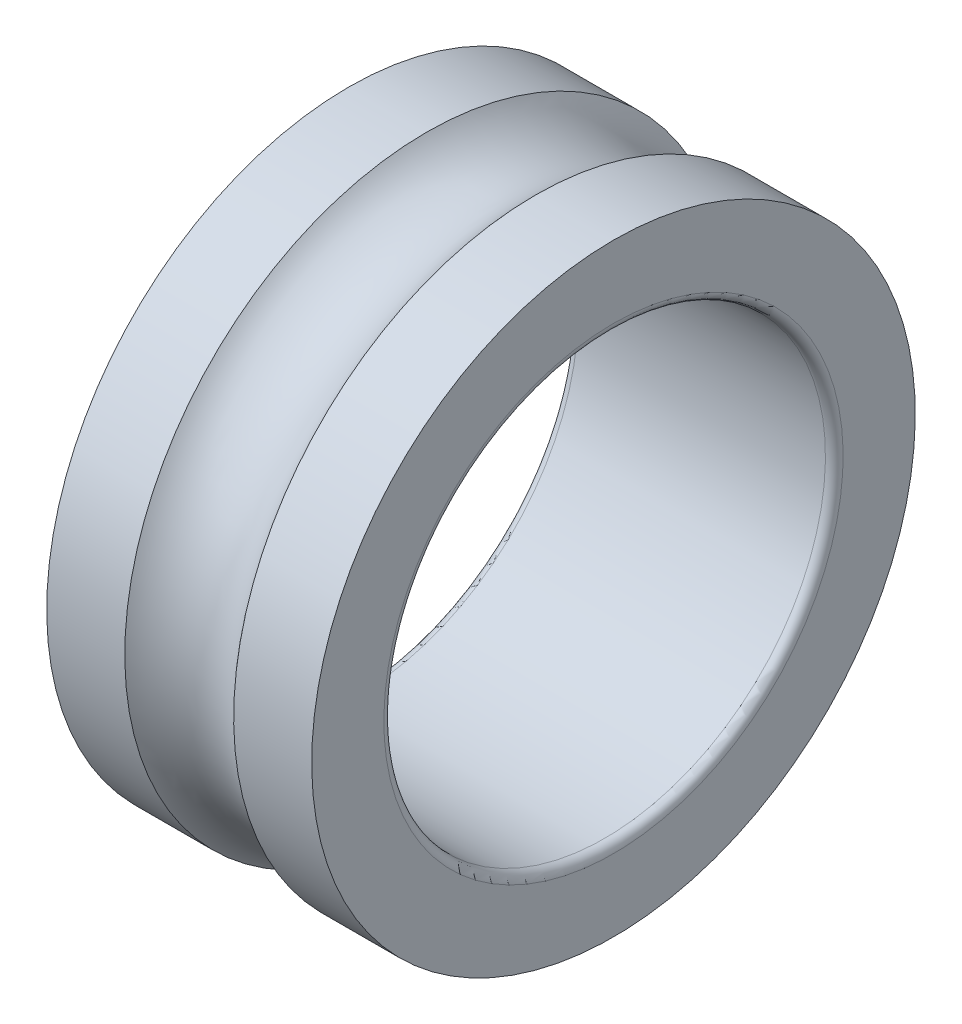
ISO-10303-21;
HEADER;
FILE_DESCRIPTION(('STEP AP214'),'2;1');
FILE_NAME('part.step','',(''),(''),'','','');
FILE_SCHEMA(('AUTOMOTIVE_DESIGN { 1 0 10303 214 1 1 1 1 }'));
ENDSEC;
DATA;
#1=APPLICATION_CONTEXT('core data for automotive mechanical design processes');
#2=APPLICATION_PROTOCOL_DEFINITION('international standard','automotive_design',2000,#1);
#3=PRODUCT_CONTEXT('',#1,'mechanical');
#4=PRODUCT('Part','Part','',(#3));
#5=PRODUCT_RELATED_PRODUCT_CATEGORY('part','',(#4));
#6=PRODUCT_DEFINITION_FORMATION('','',#4);
#7=PRODUCT_DEFINITION_CONTEXT('part definition',#1,'design');
#8=PRODUCT_DEFINITION('design','',#6,#7);
#9=PRODUCT_DEFINITION_SHAPE('','',#8);
#10=(LENGTH_UNIT() NAMED_UNIT(*) SI_UNIT(.MILLI.,.METRE.));
#11=(NAMED_UNIT(*) PLANE_ANGLE_UNIT() SI_UNIT($,.RADIAN.));
#12=(NAMED_UNIT(*) SI_UNIT($,.STERADIAN.) SOLID_ANGLE_UNIT());
#13=UNCERTAINTY_MEASURE_WITH_UNIT(LENGTH_MEASURE(1.E-05),#10,'distance_accuracy_value','');
#14=(GEOMETRIC_REPRESENTATION_CONTEXT(3) GLOBAL_UNCERTAINTY_ASSIGNED_CONTEXT((#13)) GLOBAL_UNIT_ASSIGNED_CONTEXT((#10,
#11,#12)) REPRESENTATION_CONTEXT('',''));
#15=CARTESIAN_POINT('',(0.,0.,0.));
#16=DIRECTION('',(0.,0.,1.));
#17=DIRECTION('',(1.,0.,0.));
#18=AXIS2_PLACEMENT_3D('',#15,#16,#17);
#19=CARTESIAN_POINT('',(7.67454867367814,0.,0.));
#20=DIRECTION('',(-1.,0.,0.));
#21=DIRECTION('',(0.,1.,0.));
#22=AXIS2_PLACEMENT_3D('',#19,#20,#21);
#23=CYLINDRICAL_SURFACE('',#22,10.25);
#24=CARTESIAN_POINT('',(6.34909734735627,0.,0.));
#25=DIRECTION('',(1.,0.,0.));
#26=DIRECTION('',(0.,1.,0.));
#27=AXIS2_PLACEMENT_3D('',#24,#25,#26);
#28=CIRCLE('',#27,10.25);
#29=CARTESIAN_POINT('',(6.34909734735627,10.25,0.));
#30=VERTEX_POINT('',#29);
#31=EDGE_CURVE('E11',#30,#30,#28,.T.);
#32=ORIENTED_EDGE('',*,*,#31,.T.);
#33=EDGE_LOOP('',(#32));
#34=FACE_BOUND('',#33,.T.);
#35=CARTESIAN_POINT('',(9.,0.,0.));
#36=DIRECTION('',(1.,0.,0.));
#37=DIRECTION('',(0.,1.,0.));
#38=AXIS2_PLACEMENT_3D('',#35,#36,#37);
#39=CIRCLE('',#38,10.25);
#40=CARTESIAN_POINT('',(9.,10.25,0.));
#41=VERTEX_POINT('',#40);
#42=EDGE_CURVE('E60',#41,#41,#39,.T.);
#43=ORIENTED_EDGE('',*,*,#42,.F.);
#44=EDGE_LOOP('',(#43));
#45=FACE_BOUND('',#44,.T.);
#46=ADVANCED_FACE('F19',(#34,#45),#23,.T.);
#47=CARTESIAN_POINT('',(4.5,0.,0.));
#48=DIRECTION('',(1.,0.,0.));
#49=DIRECTION('',(0.,0.,-1.));
#50=AXIS2_PLACEMENT_3D('',#47,#48,#49);
#51=TOROIDAL_SURFACE('',#50,11.75,2.381);
#52=CARTESIAN_POINT('',(2.65090265264373,0.,0.));
#53=DIRECTION('',(1.,0.,0.));
#54=DIRECTION('',(0.,1.,0.));
#55=AXIS2_PLACEMENT_3D('',#52,#53,#54);
#56=CIRCLE('',#55,10.25);
#57=CARTESIAN_POINT('',(2.65090265264373,10.25,0.));
#58=VERTEX_POINT('',#57);
#59=EDGE_CURVE('E29',#58,#58,#56,.T.);
#60=ORIENTED_EDGE('',*,*,#59,.T.);
#61=EDGE_LOOP('',(#60));
#62=FACE_BOUND('',#61,.T.);
#63=ORIENTED_EDGE('',*,*,#31,.F.);
#64=EDGE_LOOP('',(#63));
#65=FACE_BOUND('',#64,.T.);
#66=ADVANCED_FACE('F64',(#62,#65),#51,.F.);
#67=CARTESIAN_POINT('',(1.32545132632186,0.,0.));
#68=DIRECTION('',(-1.,0.,0.));
#69=DIRECTION('',(0.,1.,0.));
#70=AXIS2_PLACEMENT_3D('',#67,#68,#69);
#71=CYLINDRICAL_SURFACE('',#70,10.25);
#72=CARTESIAN_POINT('',(0.,0.,0.));
#73=DIRECTION('',(1.,0.,0.));
#74=DIRECTION('',(0.,1.,0.));
#75=AXIS2_PLACEMENT_3D('',#72,#73,#74);
#76=CIRCLE('',#75,10.25);
#77=CARTESIAN_POINT('',(0.,10.25,0.));
#78=VERTEX_POINT('',#77);
#79=EDGE_CURVE('E58',#78,#78,#76,.T.);
#80=ORIENTED_EDGE('',*,*,#79,.T.);
#81=EDGE_LOOP('',(#80));
#82=FACE_BOUND('',#81,.T.);
#83=ORIENTED_EDGE('',*,*,#59,.F.);
#84=EDGE_LOOP('',(#83));
#85=FACE_BOUND('',#84,.T.);
#86=ADVANCED_FACE('F67',(#82,#85),#71,.T.);
#87=CARTESIAN_POINT('',(0.,9.025,0.));
#88=DIRECTION('',(-1.,0.,0.));
#89=DIRECTION('',(0.,-1.,0.));
#90=AXIS2_PLACEMENT_3D('',#87,#88,#89);
#91=PLANE('',#90);
#92=CARTESIAN_POINT('',(0.,0.,0.));
#93=DIRECTION('',(1.,0.,0.));
#94=DIRECTION('',(0.,1.,0.));
#95=AXIS2_PLACEMENT_3D('',#92,#93,#94);
#96=CIRCLE('',#95,7.8);
#97=CARTESIAN_POINT('',(0.,7.8,0.));
#98=VERTEX_POINT('',#97);
#99=EDGE_CURVE('E56',#98,#98,#96,.T.);
#100=ORIENTED_EDGE('',*,*,#99,.T.);
#101=EDGE_LOOP('',(#100));
#102=FACE_BOUND('',#101,.T.);
#103=ORIENTED_EDGE('',*,*,#79,.F.);
#104=EDGE_LOOP('',(#103));
#105=FACE_BOUND('',#104,.T.);
#106=ADVANCED_FACE('F21',(#102,#105),#91,.T.);
#107=CARTESIAN_POINT('',(0.3,0.,0.));
#108=DIRECTION('',(1.,0.,0.));
#109=DIRECTION('',(0.,0.,-1.));
#110=AXIS2_PLACEMENT_3D('',#107,#108,#109);
#111=TOROIDAL_SURFACE('',#110,7.8,0.3);
#112=CARTESIAN_POINT('',(0.3,0.,0.));
#113=DIRECTION('',(1.,0.,0.));
#114=DIRECTION('',(0.,1.,0.));
#115=AXIS2_PLACEMENT_3D('',#112,#113,#114);
#116=CIRCLE('',#115,7.5);
#117=CARTESIAN_POINT('',(0.3,7.5,0.));
#118=VERTEX_POINT('',#117);
#119=EDGE_CURVE('E52',#118,#118,#116,.T.);
#120=ORIENTED_EDGE('',*,*,#119,.T.);
#121=EDGE_LOOP('',(#120));
#122=FACE_BOUND('',#121,.T.);
#123=ORIENTED_EDGE('',*,*,#99,.F.);
#124=EDGE_LOOP('',(#123));
#125=FACE_BOUND('',#124,.T.);
#126=ADVANCED_FACE('F53',(#122,#125),#111,.T.);
#127=CARTESIAN_POINT('',(4.5,0.,0.));
#128=DIRECTION('',(-1.,0.,0.));
#129=DIRECTION('',(0.,1.,0.));
#130=AXIS2_PLACEMENT_3D('',#127,#128,#129);
#131=CYLINDRICAL_SURFACE('',#130,7.5);
#132=CARTESIAN_POINT('',(8.7,0.,0.));
#133=DIRECTION('',(1.,0.,0.));
#134=DIRECTION('',(0.,1.,0.));
#135=AXIS2_PLACEMENT_3D('',#132,#133,#134);
#136=CIRCLE('',#135,7.5);
#137=CARTESIAN_POINT('',(8.7,7.5,0.));
#138=VERTEX_POINT('',#137);
#139=EDGE_CURVE('E23',#138,#138,#136,.T.);
#140=ORIENTED_EDGE('',*,*,#139,.T.);
#141=EDGE_LOOP('',(#140));
#142=FACE_BOUND('',#141,.T.);
#143=ORIENTED_EDGE('',*,*,#119,.F.);
#144=EDGE_LOOP('',(#143));
#145=FACE_BOUND('',#144,.T.);
#146=ADVANCED_FACE('F90',(#142,#145),#131,.F.);
#147=CARTESIAN_POINT('',(8.7,0.,0.));
#148=DIRECTION('',(1.,0.,0.));
#149=DIRECTION('',(0.,0.,-1.));
#150=AXIS2_PLACEMENT_3D('',#147,#148,#149);
#151=TOROIDAL_SURFACE('',#150,7.8,0.3);
#152=CARTESIAN_POINT('',(9.,0.,0.));
#153=DIRECTION('',(1.,0.,0.));
#154=DIRECTION('',(0.,1.,0.));
#155=AXIS2_PLACEMENT_3D('',#152,#153,#154);
#156=CIRCLE('',#155,7.8);
#157=CARTESIAN_POINT('',(9.,7.8,0.));
#158=VERTEX_POINT('',#157);
#159=EDGE_CURVE('E101',#158,#158,#156,.T.);
#160=ORIENTED_EDGE('',*,*,#159,.T.);
#161=EDGE_LOOP('',(#160));
#162=FACE_BOUND('',#161,.T.);
#163=ORIENTED_EDGE('',*,*,#139,.F.);
#164=EDGE_LOOP('',(#163));
#165=FACE_BOUND('',#164,.T.);
#166=ADVANCED_FACE('F87',(#162,#165),#151,.T.);
#167=CARTESIAN_POINT('',(9.,9.025,0.));
#168=DIRECTION('',(1.,0.,0.));
#169=DIRECTION('',(0.,1.,0.));
#170=AXIS2_PLACEMENT_3D('',#167,#168,#169);
#171=PLANE('',#170);
#172=ORIENTED_EDGE('',*,*,#42,.T.);
#173=EDGE_LOOP('',(#172));
#174=FACE_BOUND('',#173,.T.);
#175=ORIENTED_EDGE('',*,*,#159,.F.);
#176=EDGE_LOOP('',(#175));
#177=FACE_BOUND('',#176,.T.);
#178=ADVANCED_FACE('F84',(#174,#177),#171,.T.);
#179=CLOSED_SHELL('',(#46,#66,#86,#106,#126,#146,#166,#178));
#180=MANIFOLD_SOLID_BREP('B1',#179);
#181=ADVANCED_BREP_SHAPE_REPRESENTATION('',(#18,#180),#14);
#182=SHAPE_DEFINITION_REPRESENTATION(#9,#181);
ENDSEC;
END-ISO-10303-21;
